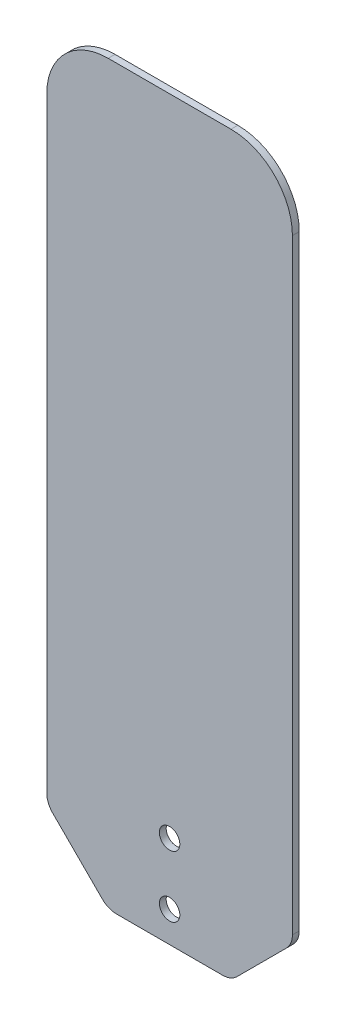
ISO-10303-21;
HEADER;
FILE_DESCRIPTION(('STEP AP214'),'2;1');
FILE_NAME('part.step','',(''),(''),'','','');
FILE_SCHEMA(('AUTOMOTIVE_DESIGN { 1 0 10303 214 1 1 1 1 }'));
ENDSEC;
DATA;
#1=APPLICATION_CONTEXT('core data for automotive mechanical design processes');
#2=APPLICATION_PROTOCOL_DEFINITION('international standard','automotive_design',2000,#1);
#3=PRODUCT_CONTEXT('',#1,'mechanical');
#4=PRODUCT('Part','Part','',(#3));
#5=PRODUCT_RELATED_PRODUCT_CATEGORY('part','',(#4));
#6=PRODUCT_DEFINITION_FORMATION('','',#4);
#7=PRODUCT_DEFINITION_CONTEXT('part definition',#1,'design');
#8=PRODUCT_DEFINITION('design','',#6,#7);
#9=PRODUCT_DEFINITION_SHAPE('','',#8);
#10=(LENGTH_UNIT() NAMED_UNIT(*) SI_UNIT(.MILLI.,.METRE.));
#11=(NAMED_UNIT(*) PLANE_ANGLE_UNIT() SI_UNIT($,.RADIAN.));
#12=(NAMED_UNIT(*) SI_UNIT($,.STERADIAN.) SOLID_ANGLE_UNIT());
#13=UNCERTAINTY_MEASURE_WITH_UNIT(LENGTH_MEASURE(1.E-05),#10,'distance_accuracy_value','');
#14=(GEOMETRIC_REPRESENTATION_CONTEXT(3) GLOBAL_UNCERTAINTY_ASSIGNED_CONTEXT((#13)) GLOBAL_UNIT_ASSIGNED_CONTEXT((#10,
#11,#12)) REPRESENTATION_CONTEXT('',''));
#15=CARTESIAN_POINT('',(0.,0.,0.));
#16=DIRECTION('',(0.,0.,1.));
#17=DIRECTION('',(1.,0.,0.));
#18=AXIS2_PLACEMENT_3D('',#15,#16,#17);
#19=CARTESIAN_POINT('',(108.1498900849,267.7645222868,1.));
#20=DIRECTION('',(0.,0.,1.));
#21=DIRECTION('',(1.,0.,0.));
#22=AXIS2_PLACEMENT_3D('',#19,#20,#21);
#23=PLANE('',#22);
#24=CARTESIAN_POINT('',(99.1498900849,173.2618815997,1.));
#25=DIRECTION('',(0.,0.,1.));
#26=DIRECTION('',(1.,0.,0.));
#27=AXIS2_PLACEMENT_3D('',#24,#25,#26);
#28=CIRCLE('',#27,1.5);
#29=CARTESIAN_POINT('',(100.6498900849,173.2618815997,1.));
#30=VERTEX_POINT('',#29);
#31=EDGE_CURVE('E158',#30,#30,#28,.T.);
#32=ORIENTED_EDGE('',*,*,#31,.F.);
#33=EDGE_LOOP('',(#32));
#34=FACE_BOUND('',#33,.T.);
#35=CARTESIAN_POINT('',(108.1498900849,267.7645222868,1.));
#36=DIRECTION('',(0.,0.,1.));
#37=DIRECTION('',(1.,0.,0.));
#38=AXIS2_PLACEMENT_3D('',#35,#36,#37);
#39=CIRCLE('',#38,8.99999999999997);
#40=CARTESIAN_POINT('',(117.1498900849,267.7645222868,1.));
#41=VERTEX_POINT('',#40);
#42=CARTESIAN_POINT('',(108.1498900849,276.7645222868,1.));
#43=VERTEX_POINT('',#42);
#44=EDGE_CURVE('E177',#41,#43,#39,.T.);
#45=ORIENTED_EDGE('',*,*,#44,.T.);
#46=DIRECTION('',(-1.,0.,0.));
#47=VECTOR('',#46,1.);
#48=CARTESIAN_POINT('',(108.1498900849,276.7645222868,1.));
#49=LINE('',#48,#47);
#50=CARTESIAN_POINT('',(90.1498900849,276.7645222868,1.));
#51=VERTEX_POINT('',#50);
#52=EDGE_CURVE('E105',#43,#51,#49,.T.);
#53=ORIENTED_EDGE('',*,*,#52,.T.);
#54=CARTESIAN_POINT('',(90.1498900849,267.7645222868,1.));
#55=DIRECTION('',(0.,0.,1.));
#56=DIRECTION('',(1.,0.,0.));
#57=AXIS2_PLACEMENT_3D('',#54,#55,#56);
#58=CIRCLE('',#57,8.99999999999998);
#59=CARTESIAN_POINT('',(81.1498900849,267.7645222868,1.));
#60=VERTEX_POINT('',#59);
#61=EDGE_CURVE('E204',#51,#60,#58,.T.);
#62=ORIENTED_EDGE('',*,*,#61,.T.);
#63=DIRECTION('',(0.,-1.,0.));
#64=VECTOR('',#63,1.);
#65=CARTESIAN_POINT('',(81.1498900849,267.7645222868,1.));
#66=LINE('',#65,#64);
#67=CARTESIAN_POINT('',(81.1498900849,179.0045222868,1.));
#68=VERTEX_POINT('',#67);
#69=EDGE_CURVE('E223',#60,#68,#66,.T.);
#70=ORIENTED_EDGE('',*,*,#69,.T.);
#71=CARTESIAN_POINT('',(84.1498900849,179.004522286819,1.));
#72=DIRECTION('',(0.,0.,1.));
#73=DIRECTION('',(1.,0.,0.));
#74=AXIS2_PLACEMENT_3D('',#71,#72,#73);
#75=CIRCLE('',#74,3.00000000000001);
#76=CARTESIAN_POINT('',(82.0285697414,176.8832019432,1.));
#77=VERTEX_POINT('',#76);
#78=EDGE_CURVE('E220',#68,#77,#75,.T.);
#79=ORIENTED_EDGE('',*,*,#78,.T.);
#80=DIRECTION('',(0.707106781186547,-0.707106781186548,0.));
#81=VECTOR('',#80,1.);
#82=CARTESIAN_POINT('',(89.2712104285,169.6405612561,1.));
#83=LINE('',#82,#81);
#84=CARTESIAN_POINT('',(89.2712104285,169.6405612561,1.));
#85=VERTEX_POINT('',#84);
#86=EDGE_CURVE('E222',#77,#85,#83,.T.);
#87=ORIENTED_EDGE('',*,*,#86,.T.);
#88=CARTESIAN_POINT('',(91.3925307720193,171.7618815997,1.));
#89=DIRECTION('',(0.,0.,1.));
#90=DIRECTION('',(1.,0.,0.));
#91=AXIS2_PLACEMENT_3D('',#88,#89,#90);
#92=CIRCLE('',#91,3.00000000000001);
#93=CARTESIAN_POINT('',(91.3925307721,168.7618815997,1.));
#94=VERTEX_POINT('',#93);
#95=EDGE_CURVE('E225',#85,#94,#92,.T.);
#96=ORIENTED_EDGE('',*,*,#95,.T.);
#97=DIRECTION('',(1.,0.,0.));
#98=VECTOR('',#97,1.);
#99=CARTESIAN_POINT('',(91.3925307721,168.7618815997,1.));
#100=LINE('',#99,#98);
#101=CARTESIAN_POINT('',(106.9072493978,168.7618815997,1.));
#102=VERTEX_POINT('',#101);
#103=EDGE_CURVE('E231',#94,#102,#100,.T.);
#104=ORIENTED_EDGE('',*,*,#103,.T.);
#105=CARTESIAN_POINT('',(106.907249397881,171.7618815997,1.));
#106=DIRECTION('',(0.,0.,1.));
#107=DIRECTION('',(1.,0.,0.));
#108=AXIS2_PLACEMENT_3D('',#105,#106,#107);
#109=CIRCLE('',#108,3.);
#110=CARTESIAN_POINT('',(109.0285697414,169.6405612561,1.));
#111=VERTEX_POINT('',#110);
#112=EDGE_CURVE('E136',#102,#111,#109,.T.);
#113=ORIENTED_EDGE('',*,*,#112,.T.);
#114=DIRECTION('',(0.707106781186547,0.707106781186548,0.));
#115=VECTOR('',#114,1.);
#116=CARTESIAN_POINT('',(109.0285697414,169.6405612561,1.));
#117=LINE('',#116,#115);
#118=CARTESIAN_POINT('',(116.2712104285,176.8832019432,1.));
#119=VERTEX_POINT('',#118);
#120=EDGE_CURVE('E130',#111,#119,#117,.T.);
#121=ORIENTED_EDGE('',*,*,#120,.T.);
#122=CARTESIAN_POINT('',(114.1498900849,179.004522286719,1.));
#123=DIRECTION('',(0.,0.,1.));
#124=DIRECTION('',(1.,0.,0.));
#125=AXIS2_PLACEMENT_3D('',#122,#123,#124);
#126=CIRCLE('',#125,3.);
#127=CARTESIAN_POINT('',(117.1498900849,179.0045222868,1.));
#128=VERTEX_POINT('',#127);
#129=EDGE_CURVE('E134',#119,#128,#126,.T.);
#130=ORIENTED_EDGE('',*,*,#129,.T.);
#131=DIRECTION('',(0.,1.,0.));
#132=VECTOR('',#131,1.);
#133=CARTESIAN_POINT('',(117.1498900849,179.0045222868,1.));
#134=LINE('',#133,#132);
#135=EDGE_CURVE('E50',#128,#41,#134,.T.);
#136=ORIENTED_EDGE('',*,*,#135,.T.);
#137=EDGE_LOOP('',(#45,#53,#62,#70,#79,#87,#96,#104,#113,#121,#130,#136));
#138=FACE_BOUND('',#137,.T.);
#139=CARTESIAN_POINT('',(99.1498900849,182.2618815997,1.));
#140=DIRECTION('',(0.,0.,1.));
#141=DIRECTION('',(1.,0.,0.));
#142=AXIS2_PLACEMENT_3D('',#139,#140,#141);
#143=CIRCLE('',#142,1.5);
#144=CARTESIAN_POINT('',(100.6498900849,182.2618815997,1.));
#145=VERTEX_POINT('',#144);
#146=EDGE_CURVE('E274',#145,#145,#143,.T.);
#147=ORIENTED_EDGE('',*,*,#146,.F.);
#148=EDGE_LOOP('',(#147));
#149=FACE_BOUND('',#148,.T.);
#150=ADVANCED_FACE('F33',(#34,#138,#149),#23,.T.);
#151=CARTESIAN_POINT('',(108.1498900849,267.7645222868,0.));
#152=DIRECTION('',(0.,0.,1.));
#153=DIRECTION('',(1.,0.,0.));
#154=AXIS2_PLACEMENT_3D('',#151,#152,#153);
#155=PLANE('',#154);
#156=CARTESIAN_POINT('',(99.1498900849,173.2618815997,0.));
#157=DIRECTION('',(0.,0.,1.));
#158=DIRECTION('',(1.,0.,0.));
#159=AXIS2_PLACEMENT_3D('',#156,#157,#158);
#160=CIRCLE('',#159,1.5);
#161=CARTESIAN_POINT('',(100.6498900849,173.2618815997,0.));
#162=VERTEX_POINT('',#161);
#163=EDGE_CURVE('E279',#162,#162,#160,.T.);
#164=ORIENTED_EDGE('',*,*,#163,.T.);
#165=EDGE_LOOP('',(#164));
#166=FACE_BOUND('',#165,.T.);
#167=CARTESIAN_POINT('',(108.1498900849,267.7645222868,0.));
#168=DIRECTION('',(0.,0.,1.));
#169=DIRECTION('',(1.,0.,0.));
#170=AXIS2_PLACEMENT_3D('',#167,#168,#169);
#171=CIRCLE('',#170,8.99999999999997);
#172=CARTESIAN_POINT('',(117.1498900849,267.7645222868,0.));
#173=VERTEX_POINT('',#172);
#174=CARTESIAN_POINT('',(108.1498900849,276.7645222868,0.));
#175=VERTEX_POINT('',#174);
#176=EDGE_CURVE('E154',#173,#175,#171,.T.);
#177=ORIENTED_EDGE('',*,*,#176,.F.);
#178=DIRECTION('',(0.,1.,0.));
#179=VECTOR('',#178,1.);
#180=CARTESIAN_POINT('',(117.1498900849,179.0045222868,0.));
#181=LINE('',#180,#179);
#182=CARTESIAN_POINT('',(117.1498900849,179.0045222868,0.));
#183=VERTEX_POINT('',#182);
#184=EDGE_CURVE('E97',#183,#173,#181,.T.);
#185=ORIENTED_EDGE('',*,*,#184,.F.);
#186=CARTESIAN_POINT('',(114.1498900849,179.004522286719,0.));
#187=DIRECTION('',(0.,0.,1.));
#188=DIRECTION('',(1.,0.,0.));
#189=AXIS2_PLACEMENT_3D('',#186,#187,#188);
#190=CIRCLE('',#189,3.);
#191=CARTESIAN_POINT('',(116.2712104285,176.8832019432,0.));
#192=VERTEX_POINT('',#191);
#193=EDGE_CURVE('E91',#192,#183,#190,.T.);
#194=ORIENTED_EDGE('',*,*,#193,.F.);
#195=DIRECTION('',(0.707106781186547,0.707106781186548,0.));
#196=VECTOR('',#195,1.);
#197=CARTESIAN_POINT('',(109.0285697414,169.6405612561,0.));
#198=LINE('',#197,#196);
#199=CARTESIAN_POINT('',(109.0285697414,169.6405612561,0.));
#200=VERTEX_POINT('',#199);
#201=EDGE_CURVE('E144',#200,#192,#198,.T.);
#202=ORIENTED_EDGE('',*,*,#201,.F.);
#203=CARTESIAN_POINT('',(106.907249397881,171.7618815997,0.));
#204=DIRECTION('',(0.,0.,1.));
#205=DIRECTION('',(1.,0.,0.));
#206=AXIS2_PLACEMENT_3D('',#203,#204,#205);
#207=CIRCLE('',#206,3.);
#208=CARTESIAN_POINT('',(106.9072493978,168.7618815997,0.));
#209=VERTEX_POINT('',#208);
#210=EDGE_CURVE('E172',#209,#200,#207,.T.);
#211=ORIENTED_EDGE('',*,*,#210,.F.);
#212=DIRECTION('',(1.,0.,0.));
#213=VECTOR('',#212,1.);
#214=CARTESIAN_POINT('',(91.3925307721,168.7618815997,0.));
#215=LINE('',#214,#213);
#216=CARTESIAN_POINT('',(91.3925307721,168.7618815997,0.));
#217=VERTEX_POINT('',#216);
#218=EDGE_CURVE('E170',#217,#209,#215,.T.);
#219=ORIENTED_EDGE('',*,*,#218,.F.);
#220=CARTESIAN_POINT('',(91.3925307720193,171.7618815997,0.));
#221=DIRECTION('',(0.,0.,1.));
#222=DIRECTION('',(1.,0.,0.));
#223=AXIS2_PLACEMENT_3D('',#220,#221,#222);
#224=CIRCLE('',#223,3.00000000000001);
#225=CARTESIAN_POINT('',(89.2712104285,169.6405612561,0.));
#226=VERTEX_POINT('',#225);
#227=EDGE_CURVE('E168',#226,#217,#224,.T.);
#228=ORIENTED_EDGE('',*,*,#227,.F.);
#229=DIRECTION('',(0.707106781186547,-0.707106781186548,0.));
#230=VECTOR('',#229,1.);
#231=CARTESIAN_POINT('',(89.2712104285,169.6405612561,0.));
#232=LINE('',#231,#230);
#233=CARTESIAN_POINT('',(82.0285697414,176.8832019432,0.));
#234=VERTEX_POINT('',#233);
#235=EDGE_CURVE('E166',#234,#226,#232,.T.);
#236=ORIENTED_EDGE('',*,*,#235,.F.);
#237=CARTESIAN_POINT('',(84.1498900849,179.004522286819,0.));
#238=DIRECTION('',(0.,0.,1.));
#239=DIRECTION('',(1.,0.,0.));
#240=AXIS2_PLACEMENT_3D('',#237,#238,#239);
#241=CIRCLE('',#240,3.00000000000001);
#242=CARTESIAN_POINT('',(81.1498900849,179.0045222868,0.));
#243=VERTEX_POINT('',#242);
#244=EDGE_CURVE('E164',#243,#234,#241,.T.);
#245=ORIENTED_EDGE('',*,*,#244,.F.);
#246=DIRECTION('',(0.,-1.,0.));
#247=VECTOR('',#246,1.);
#248=CARTESIAN_POINT('',(81.1498900849,267.7645222868,0.));
#249=LINE('',#248,#247);
#250=CARTESIAN_POINT('',(81.1498900849,267.7645222868,0.));
#251=VERTEX_POINT('',#250);
#252=EDGE_CURVE('E162',#251,#243,#249,.T.);
#253=ORIENTED_EDGE('',*,*,#252,.F.);
#254=CARTESIAN_POINT('',(90.1498900849,267.7645222868,0.));
#255=DIRECTION('',(0.,0.,1.));
#256=DIRECTION('',(1.,0.,0.));
#257=AXIS2_PLACEMENT_3D('',#254,#255,#256);
#258=CIRCLE('',#257,8.99999999999998);
#259=CARTESIAN_POINT('',(90.1498900849,276.7645222868,0.));
#260=VERTEX_POINT('',#259);
#261=EDGE_CURVE('E160',#260,#251,#258,.T.);
#262=ORIENTED_EDGE('',*,*,#261,.F.);
#263=DIRECTION('',(-1.,0.,0.));
#264=VECTOR('',#263,1.);
#265=CARTESIAN_POINT('',(108.1498900849,276.7645222868,0.));
#266=LINE('',#265,#264);
#267=EDGE_CURVE('E157',#175,#260,#266,.T.);
#268=ORIENTED_EDGE('',*,*,#267,.F.);
#269=EDGE_LOOP('',(#177,#185,#194,#202,#211,#219,#228,#236,#245,#253,#262,#268));
#270=FACE_BOUND('',#269,.T.);
#271=CARTESIAN_POINT('',(99.1498900849,182.2618815997,0.));
#272=DIRECTION('',(0.,0.,1.));
#273=DIRECTION('',(1.,0.,0.));
#274=AXIS2_PLACEMENT_3D('',#271,#272,#273);
#275=CIRCLE('',#274,1.5);
#276=CARTESIAN_POINT('',(100.6498900849,182.2618815997,0.));
#277=VERTEX_POINT('',#276);
#278=EDGE_CURVE('E277',#277,#277,#275,.T.);
#279=ORIENTED_EDGE('',*,*,#278,.T.);
#280=EDGE_LOOP('',(#279));
#281=FACE_BOUND('',#280,.T.);
#282=ADVANCED_FACE('F208',(#166,#270,#281),#155,.F.);
#283=CARTESIAN_POINT('',(108.1498900849,267.7645222868,1.));
#284=DIRECTION('',(0.,0.,-1.));
#285=DIRECTION('',(-1.,0.,0.));
#286=AXIS2_PLACEMENT_3D('',#283,#284,#285);
#287=CYLINDRICAL_SURFACE('',#286,8.99999999999997);
#288=ORIENTED_EDGE('',*,*,#176,.T.);
#289=DIRECTION('',(0.,0.,-1.));
#290=VECTOR('',#289,1.);
#291=CARTESIAN_POINT('',(108.1498900849,276.7645222868,1.));
#292=LINE('',#291,#290);
#293=EDGE_CURVE('E11',#43,#175,#292,.T.);
#294=ORIENTED_EDGE('',*,*,#293,.F.);
#295=ORIENTED_EDGE('',*,*,#44,.F.);
#296=DIRECTION('',(0.,0.,-1.));
#297=VECTOR('',#296,1.);
#298=CARTESIAN_POINT('',(117.1498900849,267.7645222868,1.));
#299=LINE('',#298,#297);
#300=EDGE_CURVE('E150',#41,#173,#299,.T.);
#301=ORIENTED_EDGE('',*,*,#300,.T.);
#302=EDGE_LOOP('',(#288,#294,#295,#301));
#303=FACE_BOUND('',#302,.T.);
#304=ADVANCED_FACE('F35',(#303),#287,.T.);
#305=CARTESIAN_POINT('',(108.1498900849,276.7645222868,1.));
#306=DIRECTION('',(0.,-1.,0.));
#307=DIRECTION('',(0.,0.,-1.));
#308=AXIS2_PLACEMENT_3D('',#305,#306,#307);
#309=PLANE('',#308);
#310=ORIENTED_EDGE('',*,*,#267,.T.);
#311=DIRECTION('',(0.,0.,-1.));
#312=VECTOR('',#311,1.);
#313=CARTESIAN_POINT('',(90.1498900849,276.7645222868,1.));
#314=LINE('',#313,#312);
#315=EDGE_CURVE('E42',#51,#260,#314,.T.);
#316=ORIENTED_EDGE('',*,*,#315,.F.);
#317=ORIENTED_EDGE('',*,*,#52,.F.);
#318=ORIENTED_EDGE('',*,*,#293,.T.);
#319=EDGE_LOOP('',(#310,#316,#317,#318));
#320=FACE_BOUND('',#319,.T.);
#321=ADVANCED_FACE('F372',(#320),#309,.F.);
#322=CARTESIAN_POINT('',(90.1498900849,267.7645222868,1.));
#323=DIRECTION('',(0.,0.,-1.));
#324=DIRECTION('',(-1.,0.,0.));
#325=AXIS2_PLACEMENT_3D('',#322,#323,#324);
#326=CYLINDRICAL_SURFACE('',#325,8.99999999999998);
#327=ORIENTED_EDGE('',*,*,#261,.T.);
#328=DIRECTION('',(0.,0.,-1.));
#329=VECTOR('',#328,1.);
#330=CARTESIAN_POINT('',(81.1498900849,267.7645222868,1.));
#331=LINE('',#330,#329);
#332=EDGE_CURVE('E196',#60,#251,#331,.T.);
#333=ORIENTED_EDGE('',*,*,#332,.F.);
#334=ORIENTED_EDGE('',*,*,#61,.F.);
#335=ORIENTED_EDGE('',*,*,#315,.T.);
#336=EDGE_LOOP('',(#327,#333,#334,#335));
#337=FACE_BOUND('',#336,.T.);
#338=ADVANCED_FACE('F202',(#337),#326,.T.);
#339=CARTESIAN_POINT('',(81.1498900849,267.7645222868,1.));
#340=DIRECTION('',(1.,0.,0.));
#341=DIRECTION('',(0.,0.,-1.));
#342=AXIS2_PLACEMENT_3D('',#339,#340,#341);
#343=PLANE('',#342);
#344=ORIENTED_EDGE('',*,*,#252,.T.);
#345=DIRECTION('',(0.,0.,-1.));
#346=VECTOR('',#345,1.);
#347=CARTESIAN_POINT('',(81.1498900849,179.0045222868,1.));
#348=LINE('',#347,#346);
#349=EDGE_CURVE('E193',#68,#243,#348,.T.);
#350=ORIENTED_EDGE('',*,*,#349,.F.);
#351=ORIENTED_EDGE('',*,*,#69,.F.);
#352=ORIENTED_EDGE('',*,*,#332,.T.);
#353=EDGE_LOOP('',(#344,#350,#351,#352));
#354=FACE_BOUND('',#353,.T.);
#355=ADVANCED_FACE('F214',(#354),#343,.F.);
#356=CARTESIAN_POINT('',(84.1498900849,179.004522286819,1.));
#357=DIRECTION('',(0.,0.,-1.));
#358=DIRECTION('',(-1.,0.,0.));
#359=AXIS2_PLACEMENT_3D('',#356,#357,#358);
#360=CYLINDRICAL_SURFACE('',#359,3.00000000000001);
#361=ORIENTED_EDGE('',*,*,#244,.T.);
#362=DIRECTION('',(0.,0.,-1.));
#363=VECTOR('',#362,1.);
#364=CARTESIAN_POINT('',(82.0285697414,176.8832019432,1.));
#365=LINE('',#364,#363);
#366=EDGE_CURVE('E190',#77,#234,#365,.T.);
#367=ORIENTED_EDGE('',*,*,#366,.F.);
#368=ORIENTED_EDGE('',*,*,#78,.F.);
#369=ORIENTED_EDGE('',*,*,#349,.T.);
#370=EDGE_LOOP('',(#361,#367,#368,#369));
#371=FACE_BOUND('',#370,.T.);
#372=ADVANCED_FACE('F218',(#371),#360,.T.);
#373=CARTESIAN_POINT('',(89.2712104285,169.6405612561,1.));
#374=DIRECTION('',(0.707106781186548,0.707106781186547,0.));
#375=DIRECTION('',(-0.707106781186547,0.707106781186548,0.));
#376=AXIS2_PLACEMENT_3D('',#373,#374,#375);
#377=PLANE('',#376);
#378=ORIENTED_EDGE('',*,*,#235,.T.);
#379=DIRECTION('',(0.,0.,-1.));
#380=VECTOR('',#379,1.);
#381=CARTESIAN_POINT('',(89.2712104285,169.6405612561,1.));
#382=LINE('',#381,#380);
#383=EDGE_CURVE('E187',#85,#226,#382,.T.);
#384=ORIENTED_EDGE('',*,*,#383,.F.);
#385=ORIENTED_EDGE('',*,*,#86,.F.);
#386=ORIENTED_EDGE('',*,*,#366,.T.);
#387=EDGE_LOOP('',(#378,#384,#385,#386));
#388=FACE_BOUND('',#387,.T.);
#389=ADVANCED_FACE('F337',(#388),#377,.F.);
#390=CARTESIAN_POINT('',(91.3925307720193,171.7618815997,1.));
#391=DIRECTION('',(0.,0.,-1.));
#392=DIRECTION('',(-1.,0.,0.));
#393=AXIS2_PLACEMENT_3D('',#390,#391,#392);
#394=CYLINDRICAL_SURFACE('',#393,3.00000000000001);
#395=ORIENTED_EDGE('',*,*,#227,.T.);
#396=DIRECTION('',(0.,0.,-1.));
#397=VECTOR('',#396,1.);
#398=CARTESIAN_POINT('',(91.3925307721,168.7618815997,1.));
#399=LINE('',#398,#397);
#400=EDGE_CURVE('E184',#94,#217,#399,.T.);
#401=ORIENTED_EDGE('',*,*,#400,.F.);
#402=ORIENTED_EDGE('',*,*,#95,.F.);
#403=ORIENTED_EDGE('',*,*,#383,.T.);
#404=EDGE_LOOP('',(#395,#401,#402,#403));
#405=FACE_BOUND('',#404,.T.);
#406=ADVANCED_FACE('F328',(#405),#394,.T.);
#407=CARTESIAN_POINT('',(91.3925307721,168.7618815997,1.));
#408=DIRECTION('',(0.,1.,0.));
#409=DIRECTION('',(0.,0.,1.));
#410=AXIS2_PLACEMENT_3D('',#407,#408,#409);
#411=PLANE('',#410);
#412=ORIENTED_EDGE('',*,*,#218,.T.);
#413=DIRECTION('',(0.,0.,-1.));
#414=VECTOR('',#413,1.);
#415=CARTESIAN_POINT('',(106.9072493978,168.7618815997,1.));
#416=LINE('',#415,#414);
#417=EDGE_CURVE('E181',#102,#209,#416,.T.);
#418=ORIENTED_EDGE('',*,*,#417,.F.);
#419=ORIENTED_EDGE('',*,*,#103,.F.);
#420=ORIENTED_EDGE('',*,*,#400,.T.);
#421=EDGE_LOOP('',(#412,#418,#419,#420));
#422=FACE_BOUND('',#421,.T.);
#423=ADVANCED_FACE('F237',(#422),#411,.F.);
#424=CARTESIAN_POINT('',(106.907249397881,171.7618815997,1.));
#425=DIRECTION('',(0.,0.,-1.));
#426=DIRECTION('',(-1.,0.,0.));
#427=AXIS2_PLACEMENT_3D('',#424,#425,#426);
#428=CYLINDRICAL_SURFACE('',#427,3.);
#429=ORIENTED_EDGE('',*,*,#210,.T.);
#430=DIRECTION('',(0.,0.,-1.));
#431=VECTOR('',#430,1.);
#432=CARTESIAN_POINT('',(109.0285697414,169.6405612561,1.));
#433=LINE('',#432,#431);
#434=EDGE_CURVE('E145',#111,#200,#433,.T.);
#435=ORIENTED_EDGE('',*,*,#434,.F.);
#436=ORIENTED_EDGE('',*,*,#112,.F.);
#437=ORIENTED_EDGE('',*,*,#417,.T.);
#438=EDGE_LOOP('',(#429,#435,#436,#437));
#439=FACE_BOUND('',#438,.T.);
#440=ADVANCED_FACE('F241',(#439),#428,.T.);
#441=CARTESIAN_POINT('',(109.0285697414,169.6405612561,1.));
#442=DIRECTION('',(-0.707106781186548,0.707106781186547,0.));
#443=DIRECTION('',(-0.707106781186547,-0.707106781186548,0.));
#444=AXIS2_PLACEMENT_3D('',#441,#442,#443);
#445=PLANE('',#444);
#446=ORIENTED_EDGE('',*,*,#201,.T.);
#447=DIRECTION('',(0.,0.,-1.));
#448=VECTOR('',#447,1.);
#449=CARTESIAN_POINT('',(116.2712104285,176.8832019432,1.));
#450=LINE('',#449,#448);
#451=EDGE_CURVE('E141',#119,#192,#450,.T.);
#452=ORIENTED_EDGE('',*,*,#451,.F.);
#453=ORIENTED_EDGE('',*,*,#120,.F.);
#454=ORIENTED_EDGE('',*,*,#434,.T.);
#455=EDGE_LOOP('',(#446,#452,#453,#454));
#456=FACE_BOUND('',#455,.T.);
#457=ADVANCED_FACE('F142',(#456),#445,.F.);
#458=CARTESIAN_POINT('',(114.1498900849,179.004522286719,1.));
#459=DIRECTION('',(0.,0.,-1.));
#460=DIRECTION('',(-1.,0.,0.));
#461=AXIS2_PLACEMENT_3D('',#458,#459,#460);
#462=CYLINDRICAL_SURFACE('',#461,3.);
#463=ORIENTED_EDGE('',*,*,#193,.T.);
#464=DIRECTION('',(0.,0.,-1.));
#465=VECTOR('',#464,1.);
#466=CARTESIAN_POINT('',(117.1498900849,179.0045222868,1.));
#467=LINE('',#466,#465);
#468=EDGE_CURVE('E146',#128,#183,#467,.T.);
#469=ORIENTED_EDGE('',*,*,#468,.F.);
#470=ORIENTED_EDGE('',*,*,#129,.F.);
#471=ORIENTED_EDGE('',*,*,#451,.T.);
#472=EDGE_LOOP('',(#463,#469,#470,#471));
#473=FACE_BOUND('',#472,.T.);
#474=ADVANCED_FACE('F148',(#473),#462,.T.);
#475=CARTESIAN_POINT('',(117.1498900849,179.0045222868,1.));
#476=DIRECTION('',(-1.,0.,0.));
#477=DIRECTION('',(0.,0.,1.));
#478=AXIS2_PLACEMENT_3D('',#475,#476,#477);
#479=PLANE('',#478);
#480=ORIENTED_EDGE('',*,*,#184,.T.);
#481=ORIENTED_EDGE('',*,*,#300,.F.);
#482=ORIENTED_EDGE('',*,*,#135,.F.);
#483=ORIENTED_EDGE('',*,*,#468,.T.);
#484=EDGE_LOOP('',(#480,#481,#482,#483));
#485=FACE_BOUND('',#484,.T.);
#486=ADVANCED_FACE('F245',(#485),#479,.F.);
#487=CARTESIAN_POINT('',(99.1498900849,173.2618815997,1.));
#488=DIRECTION('',(0.,0.,-1.));
#489=DIRECTION('',(-1.,0.,0.));
#490=AXIS2_PLACEMENT_3D('',#487,#488,#489);
#491=CYLINDRICAL_SURFACE('',#490,1.5);
#492=ORIENTED_EDGE('',*,*,#31,.T.);
#493=EDGE_LOOP('',(#492));
#494=FACE_BOUND('',#493,.T.);
#495=ORIENTED_EDGE('',*,*,#163,.F.);
#496=EDGE_LOOP('',(#495));
#497=FACE_BOUND('',#496,.T.);
#498=ADVANCED_FACE('F247',(#494,#497),#491,.F.);
#499=CARTESIAN_POINT('',(99.1498900849,182.2618815997,1.));
#500=DIRECTION('',(0.,0.,-1.));
#501=DIRECTION('',(-1.,0.,0.));
#502=AXIS2_PLACEMENT_3D('',#499,#500,#501);
#503=CYLINDRICAL_SURFACE('',#502,1.5);
#504=ORIENTED_EDGE('',*,*,#146,.T.);
#505=EDGE_LOOP('',(#504));
#506=FACE_BOUND('',#505,.T.);
#507=ORIENTED_EDGE('',*,*,#278,.F.);
#508=EDGE_LOOP('',(#507));
#509=FACE_BOUND('',#508,.T.);
#510=ADVANCED_FACE('F253',(#506,#509),#503,.F.);
#511=CLOSED_SHELL('',(#150,#282,#304,#321,#338,#355,#372,#389,#406,#423,#440,#457,#474,#486,
#498,#510));
#512=MANIFOLD_SOLID_BREP('B2',#511);
#513=ADVANCED_BREP_SHAPE_REPRESENTATION('',(#18,#512),#14);
#514=SHAPE_DEFINITION_REPRESENTATION(#9,#513);
ENDSEC;
END-ISO-10303-21;
